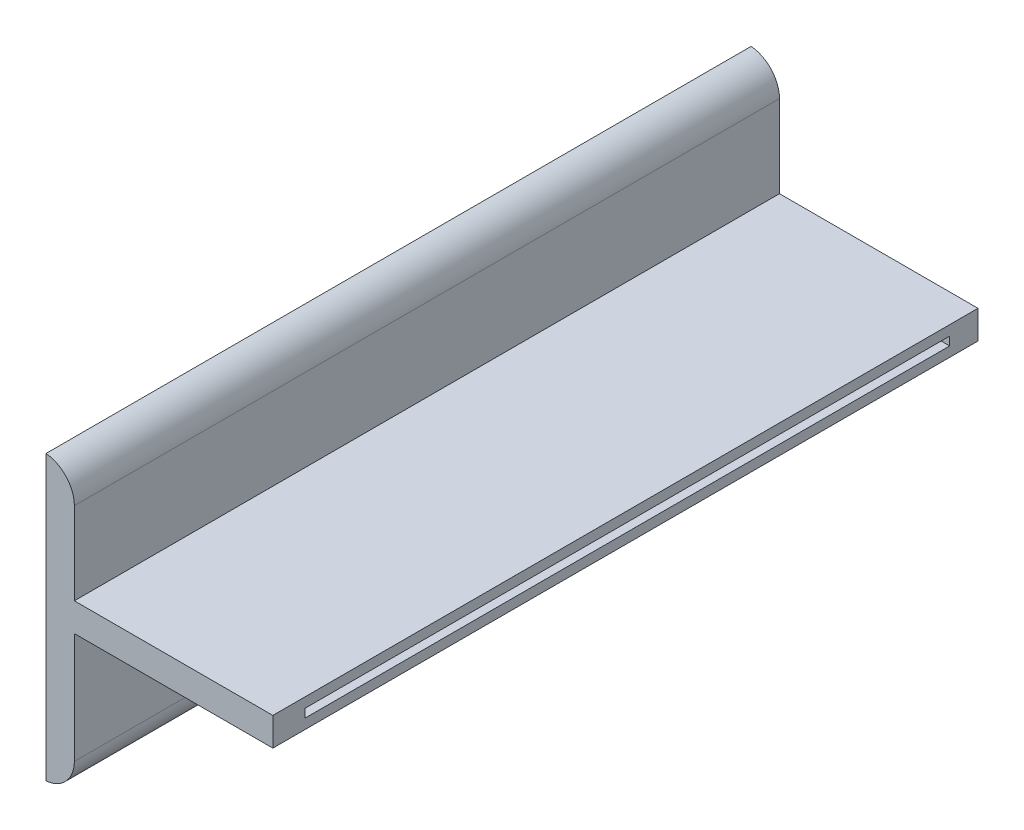
ISO-10303-21;
HEADER;
FILE_DESCRIPTION(('STEP AP214'),'2;1');
FILE_NAME('part.step','',(''),(''),'','','');
FILE_SCHEMA(('AUTOMOTIVE_DESIGN { 1 0 10303 214 1 1 1 1 }'));
ENDSEC;
DATA;
#1=APPLICATION_CONTEXT('core data for automotive mechanical design processes');
#2=APPLICATION_PROTOCOL_DEFINITION('international standard','automotive_design',2000,#1);
#3=PRODUCT_CONTEXT('',#1,'mechanical');
#4=PRODUCT('Part','Part','',(#3));
#5=PRODUCT_RELATED_PRODUCT_CATEGORY('part','',(#4));
#6=PRODUCT_DEFINITION_FORMATION('','',#4);
#7=PRODUCT_DEFINITION_CONTEXT('part definition',#1,'design');
#8=PRODUCT_DEFINITION('design','',#6,#7);
#9=PRODUCT_DEFINITION_SHAPE('','',#8);
#10=(LENGTH_UNIT() NAMED_UNIT(*) SI_UNIT(.MILLI.,.METRE.));
#11=(NAMED_UNIT(*) PLANE_ANGLE_UNIT() SI_UNIT($,.RADIAN.));
#12=(NAMED_UNIT(*) SI_UNIT($,.STERADIAN.) SOLID_ANGLE_UNIT());
#13=UNCERTAINTY_MEASURE_WITH_UNIT(LENGTH_MEASURE(1.E-05),#10,'distance_accuracy_value','');
#14=(GEOMETRIC_REPRESENTATION_CONTEXT(3) GLOBAL_UNCERTAINTY_ASSIGNED_CONTEXT((#13)) GLOBAL_UNIT_ASSIGNED_CONTEXT((#10,
#11,#12)) REPRESENTATION_CONTEXT('',''));
#15=CARTESIAN_POINT('',(0.,0.,0.));
#16=DIRECTION('',(0.,0.,1.));
#17=DIRECTION('',(1.,0.,0.));
#18=AXIS2_PLACEMENT_3D('',#15,#16,#17);
#19=CARTESIAN_POINT('',(80.,-5.9469696969697,7.02020202020202));
#20=DIRECTION('',(0.,1.,0.));
#21=DIRECTION('',(0.,0.,1.));
#22=AXIS2_PLACEMENT_3D('',#19,#20,#21);
#23=PLANE('',#22);
#24=DIRECTION('',(0.,0.,1.));
#25=VECTOR('',#24,1.);
#26=CARTESIAN_POINT('',(9.99999999999997,-5.9469696969697,7.02020202020202));
#27=LINE('',#26,#25);
#28=CARTESIAN_POINT('',(9.99999999999997,-5.9469696969697,-241.659797979798));
#29=VERTEX_POINT('',#28);
#30=CARTESIAN_POINT('',(9.99999999999997,-5.9469696969697,7.02020202020202));
#31=VERTEX_POINT('',#30);
#32=EDGE_CURVE('E155',#29,#31,#27,.T.);
#33=ORIENTED_EDGE('',*,*,#32,.F.);
#34=DIRECTION('',(-1.,0.,0.));
#35=VECTOR('',#34,1.);
#36=CARTESIAN_POINT('',(80.,-5.9469696969697,-241.659797979798));
#37=LINE('',#36,#35);
#38=CARTESIAN_POINT('',(80.,-5.9469696969697,-241.659797979798));
#39=VERTEX_POINT('',#38);
#40=EDGE_CURVE('E199',#39,#29,#37,.T.);
#41=ORIENTED_EDGE('',*,*,#40,.F.);
#42=DIRECTION('',(0.,0.,-1.));
#43=VECTOR('',#42,1.);
#44=CARTESIAN_POINT('',(80.,-5.9469696969697,7.02020202020202));
#45=LINE('',#44,#43);
#46=CARTESIAN_POINT('',(80.,-5.9469696969697,7.02020202020202));
#47=VERTEX_POINT('',#46);
#48=EDGE_CURVE('E182',#47,#39,#45,.T.);
#49=ORIENTED_EDGE('',*,*,#48,.F.);
#50=DIRECTION('',(-1.,0.,0.));
#51=VECTOR('',#50,1.);
#52=CARTESIAN_POINT('',(80.,-5.9469696969697,7.02020202020202));
#53=LINE('',#52,#51);
#54=EDGE_CURVE('E202',#47,#31,#53,.T.);
#55=ORIENTED_EDGE('',*,*,#54,.T.);
#56=EDGE_LOOP('',(#33,#41,#49,#55));
#57=FACE_BOUND('',#56,.T.);
#58=ADVANCED_FACE('F32',(#57),#23,.F.);
#59=CARTESIAN_POINT('',(80.,4.0530303030303,7.02020202020202));
#60=DIRECTION('',(0.,-1.,0.));
#61=DIRECTION('',(0.,0.,-1.));
#62=AXIS2_PLACEMENT_3D('',#59,#60,#61);
#63=PLANE('',#62);
#64=DIRECTION('',(0.,0.,-1.));
#65=VECTOR('',#64,1.);
#66=CARTESIAN_POINT('',(9.99999999999997,4.0530303030303,-241.659797979798));
#67=LINE('',#66,#65);
#68=CARTESIAN_POINT('',(9.99999999999998,4.0530303030303,7.02020202020202));
#69=VERTEX_POINT('',#68);
#70=CARTESIAN_POINT('',(9.99999999999997,4.0530303030303,-241.659797979798));
#71=VERTEX_POINT('',#70);
#72=EDGE_CURVE('E168',#69,#71,#67,.T.);
#73=ORIENTED_EDGE('',*,*,#72,.F.);
#74=DIRECTION('',(-1.,0.,0.));
#75=VECTOR('',#74,1.);
#76=CARTESIAN_POINT('',(80.,4.0530303030303,7.02020202020202));
#77=LINE('',#76,#75);
#78=CARTESIAN_POINT('',(80.,4.0530303030303,7.02020202020202));
#79=VERTEX_POINT('',#78);
#80=EDGE_CURVE('E189',#79,#69,#77,.T.);
#81=ORIENTED_EDGE('',*,*,#80,.F.);
#82=DIRECTION('',(0.,0.,1.));
#83=VECTOR('',#82,1.);
#84=CARTESIAN_POINT('',(80.,4.0530303030303,7.02020202020202));
#85=LINE('',#84,#83);
#86=CARTESIAN_POINT('',(80.,4.0530303030303,-241.659797979798));
#87=VERTEX_POINT('',#86);
#88=EDGE_CURVE('E187',#87,#79,#85,.T.);
#89=ORIENTED_EDGE('',*,*,#88,.F.);
#90=DIRECTION('',(-1.,0.,0.));
#91=VECTOR('',#90,1.);
#92=CARTESIAN_POINT('',(80.,4.0530303030303,-241.659797979798));
#93=LINE('',#92,#91);
#94=EDGE_CURVE('E196',#87,#71,#93,.T.);
#95=ORIENTED_EDGE('',*,*,#94,.T.);
#96=EDGE_LOOP('',(#73,#81,#89,#95));
#97=FACE_BOUND('',#96,.T.);
#98=ADVANCED_FACE('F239',(#97),#63,.F.);
#99=CARTESIAN_POINT('',(80.,4.0530303030303,7.02020202020202));
#100=DIRECTION('',(0.,0.,-1.));
#101=DIRECTION('',(-1.,0.,0.));
#102=AXIS2_PLACEMENT_3D('',#99,#100,#101);
#103=PLANE('',#102);
#104=DIRECTION('',(0.,-1.,0.));
#105=VECTOR('',#104,1.);
#106=CARTESIAN_POINT('',(0.,4.0530303030303,7.02020202020202));
#107=LINE('',#106,#105);
#108=CARTESIAN_POINT('',(0.,44.0530303030303,7.02020202020202));
#109=VERTEX_POINT('',#108);
#110=CARTESIAN_POINT('',(0.,-55.9469696969697,7.02020202020202));
#111=VERTEX_POINT('',#110);
#112=EDGE_CURVE('E178',#109,#111,#107,.T.);
#113=ORIENTED_EDGE('',*,*,#112,.T.);
#114=CARTESIAN_POINT('',(-1.00000000000003,-44.9925185468664,7.02020202020202));
#115=DIRECTION('',(0.,0.,-1.));
#116=DIRECTION('',(-1.,0.,0.));
#117=AXIS2_PLACEMENT_3D('',#114,#115,#116);
#118=CIRCLE('',#117,11.);
#119=CARTESIAN_POINT('',(9.99999999999997,-44.9925185468664,7.02020202020202));
#120=VERTEX_POINT('',#119);
#121=EDGE_CURVE('E211',#111,#120,#118,.F.);
#122=ORIENTED_EDGE('',*,*,#121,.T.);
#123=DIRECTION('',(0.,1.,0.));
#124=VECTOR('',#123,1.);
#125=CARTESIAN_POINT('',(9.99999999999997,-55.9469696969697,7.02020202020202));
#126=LINE('',#125,#124);
#127=EDGE_CURVE('E162',#120,#31,#126,.T.);
#128=ORIENTED_EDGE('',*,*,#127,.T.);
#129=ORIENTED_EDGE('',*,*,#54,.F.);
#130=DIRECTION('',(0.,-1.,0.));
#131=VECTOR('',#130,1.);
#132=CARTESIAN_POINT('',(80.,4.0530303030303,7.02020202020202));
#133=LINE('',#132,#131);
#134=EDGE_CURVE('E179',#79,#47,#133,.T.);
#135=ORIENTED_EDGE('',*,*,#134,.F.);
#136=ORIENTED_EDGE('',*,*,#80,.T.);
#137=DIRECTION('',(0.,-1.,0.));
#138=VECTOR('',#137,1.);
#139=CARTESIAN_POINT('',(9.99999999999999,44.0530303030303,7.02020202020202));
#140=LINE('',#139,#138);
#141=CARTESIAN_POINT('',(9.99999999999999,33.098579152927,7.02020202020202));
#142=VERTEX_POINT('',#141);
#143=EDGE_CURVE('E176',#142,#69,#140,.T.);
#144=ORIENTED_EDGE('',*,*,#143,.F.);
#145=CARTESIAN_POINT('',(-1.00000000000001,33.098579152927,7.02020202020202));
#146=DIRECTION('',(0.,0.,-1.));
#147=DIRECTION('',(-1.,0.,0.));
#148=AXIS2_PLACEMENT_3D('',#145,#146,#147);
#149=CIRCLE('',#148,11.);
#150=EDGE_CURVE('E209',#142,#109,#149,.F.);
#151=ORIENTED_EDGE('',*,*,#150,.T.);
#152=EDGE_LOOP('',(#113,#122,#128,#129,#135,#136,#144,#151));
#153=FACE_BOUND('',#152,.T.);
#154=ADVANCED_FACE('F213',(#153),#103,.F.);
#155=CARTESIAN_POINT('',(80.,4.0530303030303,-241.659797979798));
#156=DIRECTION('',(0.,0.,1.));
#157=DIRECTION('',(1.,0.,0.));
#158=AXIS2_PLACEMENT_3D('',#155,#156,#157);
#159=PLANE('',#158);
#160=DIRECTION('',(0.,1.,0.));
#161=VECTOR('',#160,1.);
#162=CARTESIAN_POINT('',(9.99999999999997,-55.9469696969697,-241.659797979798));
#163=LINE('',#162,#161);
#164=CARTESIAN_POINT('',(9.99999999999997,-44.9925185468664,-241.659797979798));
#165=VERTEX_POINT('',#164);
#166=EDGE_CURVE('E166',#165,#29,#163,.T.);
#167=ORIENTED_EDGE('',*,*,#166,.F.);
#168=CARTESIAN_POINT('',(-1.00000000000003,-44.9925185468664,-241.659797979798));
#169=DIRECTION('',(0.,0.,1.));
#170=DIRECTION('',(1.,0.,0.));
#171=AXIS2_PLACEMENT_3D('',#168,#169,#170);
#172=CIRCLE('',#171,11.);
#173=CARTESIAN_POINT('',(0.,-55.9469696969697,-241.659797979798));
#174=VERTEX_POINT('',#173);
#175=EDGE_CURVE('E11',#165,#174,#172,.F.);
#176=ORIENTED_EDGE('',*,*,#175,.T.);
#177=DIRECTION('',(0.,1.,0.));
#178=VECTOR('',#177,1.);
#179=CARTESIAN_POINT('',(0.,4.0530303030303,-241.659797979798));
#180=LINE('',#179,#178);
#181=CARTESIAN_POINT('',(0.,44.0530303030303,-241.659797979798));
#182=VERTEX_POINT('',#181);
#183=EDGE_CURVE('E183',#174,#182,#180,.T.);
#184=ORIENTED_EDGE('',*,*,#183,.T.);
#185=CARTESIAN_POINT('',(-1.00000000000001,33.098579152927,-241.659797979798));
#186=DIRECTION('',(0.,0.,1.));
#187=DIRECTION('',(1.,0.,0.));
#188=AXIS2_PLACEMENT_3D('',#185,#186,#187);
#189=CIRCLE('',#188,11.);
#190=CARTESIAN_POINT('',(9.99999999999997,33.098579152927,-241.659797979798));
#191=VERTEX_POINT('',#190);
#192=EDGE_CURVE('E205',#182,#191,#189,.F.);
#193=ORIENTED_EDGE('',*,*,#192,.T.);
#194=DIRECTION('',(0.,-1.,0.));
#195=VECTOR('',#194,1.);
#196=CARTESIAN_POINT('',(9.99999999999997,44.0530303030303,-241.659797979798));
#197=LINE('',#196,#195);
#198=EDGE_CURVE('E172',#191,#71,#197,.T.);
#199=ORIENTED_EDGE('',*,*,#198,.T.);
#200=ORIENTED_EDGE('',*,*,#94,.F.);
#201=DIRECTION('',(0.,1.,0.));
#202=VECTOR('',#201,1.);
#203=CARTESIAN_POINT('',(80.,4.0530303030303,-241.659797979798));
#204=LINE('',#203,#202);
#205=EDGE_CURVE('E185',#39,#87,#204,.T.);
#206=ORIENTED_EDGE('',*,*,#205,.F.);
#207=ORIENTED_EDGE('',*,*,#40,.T.);
#208=EDGE_LOOP('',(#167,#176,#184,#193,#199,#200,#206,#207));
#209=FACE_BOUND('',#208,.T.);
#210=ADVANCED_FACE('F223',(#209),#159,.F.);
#211=CARTESIAN_POINT('',(80.,0.,0.));
#212=DIRECTION('',(1.,0.,0.));
#213=DIRECTION('',(0.,0.,-1.));
#214=AXIS2_PLACEMENT_3D('',#211,#212,#213);
#215=PLANE('',#214);
#216=DIRECTION('',(0.,-1.,0.));
#217=VECTOR('',#216,1.);
#218=CARTESIAN_POINT('',(80.,0.553030303030302,-4.24325856333721));
#219=LINE('',#218,#217);
#220=CARTESIAN_POINT('',(80.,0.553030303030302,-4.24325856333721));
#221=VERTEX_POINT('',#220);
#222=CARTESIAN_POINT('',(80.,-2.4469696969697,-4.24325856333721));
#223=VERTEX_POINT('',#222);
#224=EDGE_CURVE('E47',#221,#223,#219,.T.);
#225=ORIENTED_EDGE('',*,*,#224,.F.);
#226=DIRECTION('',(0.,0.,1.));
#227=VECTOR('',#226,1.);
#228=CARTESIAN_POINT('',(80.,0.553030303030302,-231.659797979798));
#229=LINE('',#228,#227);
#230=CARTESIAN_POINT('',(80.,0.553030303030302,-231.659797979798));
#231=VERTEX_POINT('',#230);
#232=EDGE_CURVE('E140',#231,#221,#229,.T.);
#233=ORIENTED_EDGE('',*,*,#232,.F.);
#234=DIRECTION('',(0.,1.,0.));
#235=VECTOR('',#234,1.);
#236=CARTESIAN_POINT('',(80.,0.553030303030302,-231.659797979798));
#237=LINE('',#236,#235);
#238=CARTESIAN_POINT('',(80.,-2.4469696969697,-231.659797979798));
#239=VERTEX_POINT('',#238);
#240=EDGE_CURVE('E143',#239,#231,#237,.T.);
#241=ORIENTED_EDGE('',*,*,#240,.F.);
#242=DIRECTION('',(0.,0.,-1.));
#243=VECTOR('',#242,1.);
#244=CARTESIAN_POINT('',(80.,-2.4469696969697,-231.659797979798));
#245=LINE('',#244,#243);
#246=EDGE_CURVE('E149',#223,#239,#245,.T.);
#247=ORIENTED_EDGE('',*,*,#246,.F.);
#248=EDGE_LOOP('',(#225,#233,#241,#247));
#249=FACE_BOUND('',#248,.T.);
#250=ORIENTED_EDGE('',*,*,#134,.T.);
#251=ORIENTED_EDGE('',*,*,#48,.T.);
#252=ORIENTED_EDGE('',*,*,#205,.T.);
#253=ORIENTED_EDGE('',*,*,#88,.T.);
#254=EDGE_LOOP('',(#250,#251,#252,#253));
#255=FACE_BOUND('',#254,.T.);
#256=ADVANCED_FACE('F243',(#249,#255),#215,.T.);
#257=CARTESIAN_POINT('',(0.,0.,0.));
#258=DIRECTION('',(1.,0.,0.));
#259=DIRECTION('',(0.,0.,-1.));
#260=AXIS2_PLACEMENT_3D('',#257,#258,#259);
#261=PLANE('',#260);
#262=ORIENTED_EDGE('',*,*,#112,.F.);
#263=DIRECTION('',(0.,0.,1.));
#264=VECTOR('',#263,1.);
#265=CARTESIAN_POINT('',(0.,44.0530303030303,-241.659797979798));
#266=LINE('',#265,#264);
#267=EDGE_CURVE('E169',#182,#109,#266,.T.);
#268=ORIENTED_EDGE('',*,*,#267,.F.);
#269=ORIENTED_EDGE('',*,*,#183,.F.);
#270=DIRECTION('',(0.,0.,-1.));
#271=VECTOR('',#270,1.);
#272=CARTESIAN_POINT('',(0.,-55.9469696969697,7.02020202020202));
#273=LINE('',#272,#271);
#274=EDGE_CURVE('E159',#111,#174,#273,.T.);
#275=ORIENTED_EDGE('',*,*,#274,.F.);
#276=EDGE_LOOP('',(#262,#268,#269,#275));
#277=FACE_BOUND('',#276,.T.);
#278=ADVANCED_FACE('F226',(#277),#261,.F.);
#279=CARTESIAN_POINT('',(9.99999999999997,44.0530303030303,-241.659797979798));
#280=DIRECTION('',(-1.,0.,0.));
#281=DIRECTION('',(0.,0.,1.));
#282=AXIS2_PLACEMENT_3D('',#279,#280,#281);
#283=PLANE('',#282);
#284=ORIENTED_EDGE('',*,*,#198,.F.);
#285=DIRECTION('',(0.,0.,-1.));
#286=VECTOR('',#285,1.);
#287=CARTESIAN_POINT('',(9.99999999999997,33.098579152927,-241.659797979798));
#288=LINE('',#287,#286);
#289=EDGE_CURVE('E207',#191,#142,#288,.F.);
#290=ORIENTED_EDGE('',*,*,#289,.T.);
#291=ORIENTED_EDGE('',*,*,#143,.T.);
#292=ORIENTED_EDGE('',*,*,#72,.T.);
#293=EDGE_LOOP('',(#284,#290,#291,#292));
#294=FACE_BOUND('',#293,.T.);
#295=ADVANCED_FACE('F234',(#294),#283,.F.);
#296=CARTESIAN_POINT('',(9.99999999999997,-55.9469696969697,7.02020202020202));
#297=DIRECTION('',(-1.,0.,0.));
#298=DIRECTION('',(0.,0.,1.));
#299=AXIS2_PLACEMENT_3D('',#296,#297,#298);
#300=PLANE('',#299);
#301=ORIENTED_EDGE('',*,*,#127,.F.);
#302=DIRECTION('',(0.,0.,1.));
#303=VECTOR('',#302,1.);
#304=CARTESIAN_POINT('',(9.99999999999997,-44.9925185468664,7.02020202020202));
#305=LINE('',#304,#303);
#306=EDGE_CURVE('E40',#120,#165,#305,.F.);
#307=ORIENTED_EDGE('',*,*,#306,.T.);
#308=ORIENTED_EDGE('',*,*,#166,.T.);
#309=ORIENTED_EDGE('',*,*,#32,.T.);
#310=EDGE_LOOP('',(#301,#307,#308,#309));
#311=FACE_BOUND('',#310,.T.);
#312=ADVANCED_FACE('F218',(#311),#300,.F.);
#313=CARTESIAN_POINT('',(-1.00000000000001,33.098579152927,0.));
#314=DIRECTION('',(0.,0.,-1.));
#315=DIRECTION('',(-1.,0.,0.));
#316=AXIS2_PLACEMENT_3D('',#313,#314,#315);
#317=CYLINDRICAL_SURFACE('',#316,11.);
#318=ORIENTED_EDGE('',*,*,#150,.F.);
#319=ORIENTED_EDGE('',*,*,#289,.F.);
#320=ORIENTED_EDGE('',*,*,#192,.F.);
#321=ORIENTED_EDGE('',*,*,#267,.T.);
#322=EDGE_LOOP('',(#318,#319,#320,#321));
#323=FACE_BOUND('',#322,.T.);
#324=ADVANCED_FACE('F229',(#323),#317,.T.);
#325=CARTESIAN_POINT('',(-1.00000000000003,-44.9925185468664,0.));
#326=DIRECTION('',(0.,0.,1.));
#327=DIRECTION('',(0.,-1.,0.));
#328=AXIS2_PLACEMENT_3D('',#325,#326,#327);
#329=CYLINDRICAL_SURFACE('',#328,11.);
#330=ORIENTED_EDGE('',*,*,#175,.F.);
#331=ORIENTED_EDGE('',*,*,#306,.F.);
#332=ORIENTED_EDGE('',*,*,#121,.F.);
#333=ORIENTED_EDGE('',*,*,#274,.T.);
#334=EDGE_LOOP('',(#330,#331,#332,#333));
#335=FACE_BOUND('',#334,.T.);
#336=ADVANCED_FACE('F34',(#335),#329,.T.);
#337=CARTESIAN_POINT('',(10.,0.553030303030302,-4.24325856333721));
#338=DIRECTION('',(0.,0.,1.));
#339=DIRECTION('',(1.,0.,0.));
#340=AXIS2_PLACEMENT_3D('',#337,#338,#339);
#341=PLANE('',#340);
#342=ORIENTED_EDGE('',*,*,#224,.T.);
#343=DIRECTION('',(1.,0.,0.));
#344=VECTOR('',#343,1.);
#345=CARTESIAN_POINT('',(10.,-2.4469696969697,-4.24325856333721));
#346=LINE('',#345,#344);
#347=CARTESIAN_POINT('',(10.,-2.4469696969697,-4.24325856333721));
#348=VERTEX_POINT('',#347);
#349=EDGE_CURVE('E118',#348,#223,#346,.T.);
#350=ORIENTED_EDGE('',*,*,#349,.F.);
#351=DIRECTION('',(0.,-1.,0.));
#352=VECTOR('',#351,1.);
#353=CARTESIAN_POINT('',(10.,0.553030303030302,-4.24325856333721));
#354=LINE('',#353,#352);
#355=CARTESIAN_POINT('',(10.,0.553030303030302,-4.24325856333721));
#356=VERTEX_POINT('',#355);
#357=EDGE_CURVE('E122',#356,#348,#354,.T.);
#358=ORIENTED_EDGE('',*,*,#357,.F.);
#359=DIRECTION('',(1.,0.,0.));
#360=VECTOR('',#359,1.);
#361=CARTESIAN_POINT('',(10.,0.553030303030302,-4.24325856333721));
#362=LINE('',#361,#360);
#363=EDGE_CURVE('E153',#356,#221,#362,.T.);
#364=ORIENTED_EDGE('',*,*,#363,.T.);
#365=EDGE_LOOP('',(#342,#350,#358,#364));
#366=FACE_BOUND('',#365,.T.);
#367=ADVANCED_FACE('F120',(#366),#341,.F.);
#368=CARTESIAN_POINT('',(10.,0.553030303030302,-231.659797979798));
#369=DIRECTION('',(0.,1.,0.));
#370=DIRECTION('',(0.,0.,1.));
#371=AXIS2_PLACEMENT_3D('',#368,#369,#370);
#372=PLANE('',#371);
#373=ORIENTED_EDGE('',*,*,#232,.T.);
#374=ORIENTED_EDGE('',*,*,#363,.F.);
#375=DIRECTION('',(0.,0.,1.));
#376=VECTOR('',#375,1.);
#377=CARTESIAN_POINT('',(10.,0.553030303030302,-231.659797979798));
#378=LINE('',#377,#376);
#379=CARTESIAN_POINT('',(10.,0.553030303030302,-231.659797979798));
#380=VERTEX_POINT('',#379);
#381=EDGE_CURVE('E128',#380,#356,#378,.T.);
#382=ORIENTED_EDGE('',*,*,#381,.F.);
#383=DIRECTION('',(1.,0.,0.));
#384=VECTOR('',#383,1.);
#385=CARTESIAN_POINT('',(10.,0.553030303030302,-231.659797979798));
#386=LINE('',#385,#384);
#387=EDGE_CURVE('E156',#380,#231,#386,.T.);
#388=ORIENTED_EDGE('',*,*,#387,.T.);
#389=EDGE_LOOP('',(#373,#374,#382,#388));
#390=FACE_BOUND('',#389,.T.);
#391=ADVANCED_FACE('F335',(#390),#372,.F.);
#392=CARTESIAN_POINT('',(10.,0.553030303030302,-231.659797979798));
#393=DIRECTION('',(0.,0.,-1.));
#394=DIRECTION('',(-1.,0.,0.));
#395=AXIS2_PLACEMENT_3D('',#392,#393,#394);
#396=PLANE('',#395);
#397=ORIENTED_EDGE('',*,*,#240,.T.);
#398=ORIENTED_EDGE('',*,*,#387,.F.);
#399=DIRECTION('',(0.,1.,0.));
#400=VECTOR('',#399,1.);
#401=CARTESIAN_POINT('',(10.,0.553030303030302,-231.659797979798));
#402=LINE('',#401,#400);
#403=CARTESIAN_POINT('',(10.,-2.4469696969697,-231.659797979798));
#404=VERTEX_POINT('',#403);
#405=EDGE_CURVE('E136',#404,#380,#402,.T.);
#406=ORIENTED_EDGE('',*,*,#405,.F.);
#407=DIRECTION('',(1.,0.,0.));
#408=VECTOR('',#407,1.);
#409=CARTESIAN_POINT('',(10.,-2.4469696969697,-231.659797979798));
#410=LINE('',#409,#408);
#411=EDGE_CURVE('E127',#404,#239,#410,.T.);
#412=ORIENTED_EDGE('',*,*,#411,.T.);
#413=EDGE_LOOP('',(#397,#398,#406,#412));
#414=FACE_BOUND('',#413,.T.);
#415=ADVANCED_FACE('F343',(#414),#396,.F.);
#416=CARTESIAN_POINT('',(10.,-2.4469696969697,-231.659797979798));
#417=DIRECTION('',(0.,-1.,0.));
#418=DIRECTION('',(0.,0.,-1.));
#419=AXIS2_PLACEMENT_3D('',#416,#417,#418);
#420=PLANE('',#419);
#421=ORIENTED_EDGE('',*,*,#246,.T.);
#422=ORIENTED_EDGE('',*,*,#411,.F.);
#423=DIRECTION('',(0.,0.,-1.));
#424=VECTOR('',#423,1.);
#425=CARTESIAN_POINT('',(10.,-2.4469696969697,-231.659797979798));
#426=LINE('',#425,#424);
#427=EDGE_CURVE('E131',#348,#404,#426,.T.);
#428=ORIENTED_EDGE('',*,*,#427,.F.);
#429=ORIENTED_EDGE('',*,*,#349,.T.);
#430=EDGE_LOOP('',(#421,#422,#428,#429));
#431=FACE_BOUND('',#430,.T.);
#432=ADVANCED_FACE('F132',(#431),#420,.F.);
#433=CARTESIAN_POINT('',(10.,0.,0.));
#434=DIRECTION('',(-1.,0.,0.));
#435=DIRECTION('',(0.,0.,1.));
#436=AXIS2_PLACEMENT_3D('',#433,#434,#435);
#437=PLANE('',#436);
#438=ORIENTED_EDGE('',*,*,#357,.T.);
#439=ORIENTED_EDGE('',*,*,#427,.T.);
#440=ORIENTED_EDGE('',*,*,#405,.T.);
#441=ORIENTED_EDGE('',*,*,#381,.T.);
#442=EDGE_LOOP('',(#438,#439,#440,#441));
#443=FACE_BOUND('',#442,.T.);
#444=ADVANCED_FACE('F138',(#443),#437,.F.);
#445=CLOSED_SHELL('',(#58,#98,#154,#210,#256,#278,#295,#312,#324,#336,#367,#391,#415,#432,#444));
#446=MANIFOLD_SOLID_BREP('B2',#445);
#447=ADVANCED_BREP_SHAPE_REPRESENTATION('',(#18,#446),#14);
#448=SHAPE_DEFINITION_REPRESENTATION(#9,#447);
ENDSEC;
END-ISO-10303-21;
